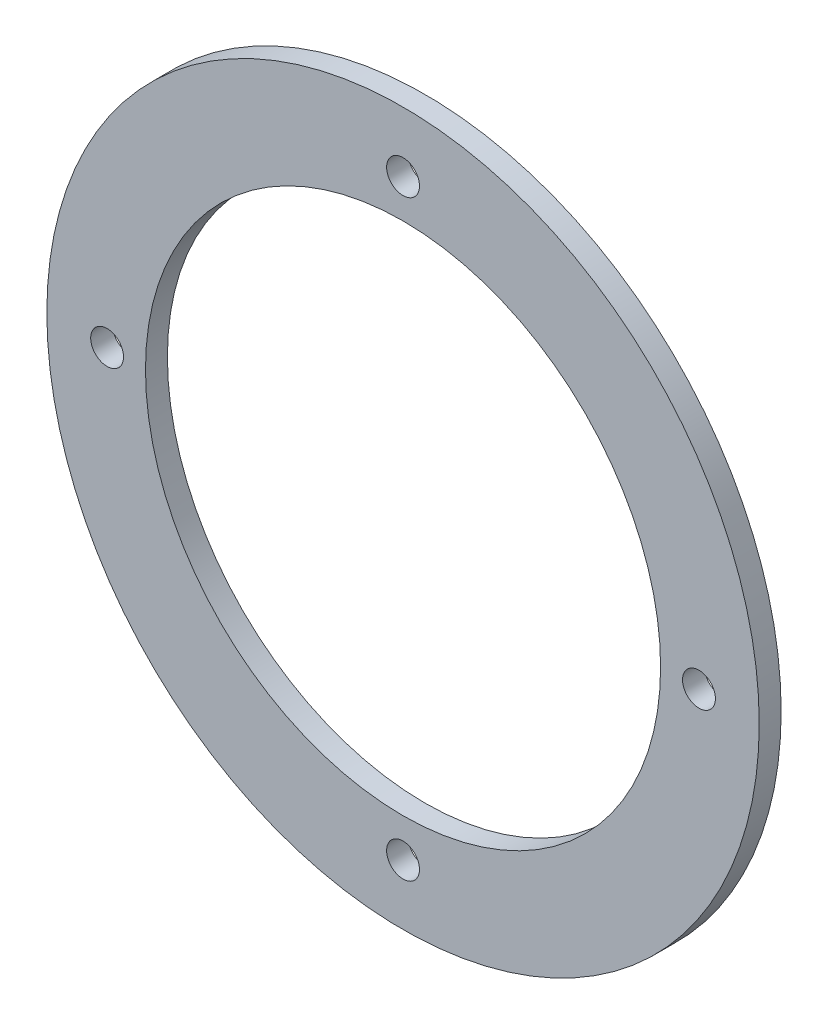
ISO-10303-21;
HEADER;
FILE_DESCRIPTION(('STEP AP214'),'2;1');
FILE_NAME('part.step','',(''),(''),'','','');
FILE_SCHEMA(('AUTOMOTIVE_DESIGN { 1 0 10303 214 1 1 1 1 }'));
ENDSEC;
DATA;
#1=APPLICATION_CONTEXT('core data for automotive mechanical design processes');
#2=APPLICATION_PROTOCOL_DEFINITION('international standard','automotive_design',2000,#1);
#3=PRODUCT_CONTEXT('',#1,'mechanical');
#4=PRODUCT('Part','Part','',(#3));
#5=PRODUCT_RELATED_PRODUCT_CATEGORY('part','',(#4));
#6=PRODUCT_DEFINITION_FORMATION('','',#4);
#7=PRODUCT_DEFINITION_CONTEXT('part definition',#1,'design');
#8=PRODUCT_DEFINITION('design','',#6,#7);
#9=PRODUCT_DEFINITION_SHAPE('','',#8);
#10=(LENGTH_UNIT() NAMED_UNIT(*) SI_UNIT(.MILLI.,.METRE.));
#11=(NAMED_UNIT(*) PLANE_ANGLE_UNIT() SI_UNIT($,.RADIAN.));
#12=(NAMED_UNIT(*) SI_UNIT($,.STERADIAN.) SOLID_ANGLE_UNIT());
#13=UNCERTAINTY_MEASURE_WITH_UNIT(LENGTH_MEASURE(1.E-05),#10,'distance_accuracy_value','');
#14=(GEOMETRIC_REPRESENTATION_CONTEXT(3) GLOBAL_UNCERTAINTY_ASSIGNED_CONTEXT((#13)) GLOBAL_UNIT_ASSIGNED_CONTEXT((#10,
#11,#12)) REPRESENTATION_CONTEXT('',''));
#15=CARTESIAN_POINT('',(0.,0.,0.));
#16=DIRECTION('',(0.,0.,1.));
#17=DIRECTION('',(1.,0.,0.));
#18=AXIS2_PLACEMENT_3D('',#15,#16,#17);
#19=CARTESIAN_POINT('',(0.,0.,2.));
#20=DIRECTION('',(0.,0.,1.));
#21=DIRECTION('',(1.,0.,0.));
#22=AXIS2_PLACEMENT_3D('',#19,#20,#21);
#23=PLANE('',#22);
#24=CARTESIAN_POINT('',(0.,27.,2.));
#25=DIRECTION('',(0.,0.,1.));
#26=DIRECTION('',(1.,0.,0.));
#27=AXIS2_PLACEMENT_3D('',#24,#25,#26);
#28=CIRCLE('',#27,1.5);
#29=CARTESIAN_POINT('',(1.5,27.,2.));
#30=VERTEX_POINT('',#29);
#31=EDGE_CURVE('E59',#30,#30,#28,.T.);
#32=ORIENTED_EDGE('',*,*,#31,.F.);
#33=EDGE_LOOP('',(#32));
#34=FACE_BOUND('',#33,.T.);
#35=CARTESIAN_POINT('',(-27.,0.,2.));
#36=DIRECTION('',(0.,0.,1.));
#37=DIRECTION('',(1.,0.,0.));
#38=AXIS2_PLACEMENT_3D('',#35,#36,#37);
#39=CIRCLE('',#38,1.5);
#40=CARTESIAN_POINT('',(-25.5,0.,2.));
#41=VERTEX_POINT('',#40);
#42=EDGE_CURVE('E47',#41,#41,#39,.T.);
#43=ORIENTED_EDGE('',*,*,#42,.F.);
#44=EDGE_LOOP('',(#43));
#45=FACE_BOUND('',#44,.T.);
#46=CARTESIAN_POINT('',(0.,0.,2.));
#47=DIRECTION('',(0.,0.,1.));
#48=DIRECTION('',(1.,0.,0.));
#49=AXIS2_PLACEMENT_3D('',#46,#47,#48);
#50=CIRCLE('',#49,32.5);
#51=CARTESIAN_POINT('',(32.5,0.,2.));
#52=VERTEX_POINT('',#51);
#53=EDGE_CURVE('E10',#52,#52,#50,.T.);
#54=ORIENTED_EDGE('',*,*,#53,.T.);
#55=EDGE_LOOP('',(#54));
#56=FACE_BOUND('',#55,.T.);
#57=CARTESIAN_POINT('',(0.,0.,2.));
#58=DIRECTION('',(0.,0.,1.));
#59=DIRECTION('',(1.,0.,0.));
#60=AXIS2_PLACEMENT_3D('',#57,#58,#59);
#61=CIRCLE('',#60,23.5);
#62=CARTESIAN_POINT('',(23.5,0.,2.));
#63=VERTEX_POINT('',#62);
#64=EDGE_CURVE('E42',#63,#63,#61,.T.);
#65=ORIENTED_EDGE('',*,*,#64,.F.);
#66=EDGE_LOOP('',(#65));
#67=FACE_BOUND('',#66,.T.);
#68=CARTESIAN_POINT('',(27.,0.,2.));
#69=DIRECTION('',(0.,0.,1.));
#70=DIRECTION('',(1.,0.,0.));
#71=AXIS2_PLACEMENT_3D('',#68,#69,#70);
#72=CIRCLE('',#71,1.5);
#73=CARTESIAN_POINT('',(28.5,0.,2.));
#74=VERTEX_POINT('',#73);
#75=EDGE_CURVE('E53',#74,#74,#72,.T.);
#76=ORIENTED_EDGE('',*,*,#75,.F.);
#77=EDGE_LOOP('',(#76));
#78=FACE_BOUND('',#77,.T.);
#79=CARTESIAN_POINT('',(0.,-27.,2.));
#80=DIRECTION('',(0.,0.,1.));
#81=DIRECTION('',(1.,0.,0.));
#82=AXIS2_PLACEMENT_3D('',#79,#80,#81);
#83=CIRCLE('',#82,1.5);
#84=CARTESIAN_POINT('',(1.5,-27.,2.));
#85=VERTEX_POINT('',#84);
#86=EDGE_CURVE('E65',#85,#85,#83,.T.);
#87=ORIENTED_EDGE('',*,*,#86,.F.);
#88=EDGE_LOOP('',(#87));
#89=FACE_BOUND('',#88,.T.);
#90=ADVANCED_FACE('F31',(#34,#45,#56,#67,#78,#89),#23,.T.);
#91=CARTESIAN_POINT('',(0.,0.,0.));
#92=DIRECTION('',(0.,0.,1.));
#93=DIRECTION('',(1.,0.,0.));
#94=AXIS2_PLACEMENT_3D('',#91,#92,#93);
#95=PLANE('',#94);
#96=CARTESIAN_POINT('',(0.,0.,0.));
#97=DIRECTION('',(0.,0.,1.));
#98=DIRECTION('',(1.,0.,0.));
#99=AXIS2_PLACEMENT_3D('',#96,#97,#98);
#100=CIRCLE('',#99,32.5);
#101=CARTESIAN_POINT('',(32.5,0.,0.));
#102=VERTEX_POINT('',#101);
#103=EDGE_CURVE('E35',#102,#102,#100,.T.);
#104=ORIENTED_EDGE('',*,*,#103,.F.);
#105=EDGE_LOOP('',(#104));
#106=FACE_BOUND('',#105,.T.);
#107=CARTESIAN_POINT('',(0.,0.,0.));
#108=DIRECTION('',(0.,0.,1.));
#109=DIRECTION('',(1.,0.,0.));
#110=AXIS2_PLACEMENT_3D('',#107,#108,#109);
#111=CIRCLE('',#110,23.5);
#112=CARTESIAN_POINT('',(23.5,0.,0.));
#113=VERTEX_POINT('',#112);
#114=EDGE_CURVE('E44',#113,#113,#111,.T.);
#115=ORIENTED_EDGE('',*,*,#114,.T.);
#116=EDGE_LOOP('',(#115));
#117=FACE_BOUND('',#116,.T.);
#118=CARTESIAN_POINT('',(-27.,0.,0.));
#119=DIRECTION('',(0.,0.,1.));
#120=DIRECTION('',(1.,0.,0.));
#121=AXIS2_PLACEMENT_3D('',#118,#119,#120);
#122=CIRCLE('',#121,1.5);
#123=CARTESIAN_POINT('',(-25.5,0.,0.));
#124=VERTEX_POINT('',#123);
#125=EDGE_CURVE('E50',#124,#124,#122,.T.);
#126=ORIENTED_EDGE('',*,*,#125,.T.);
#127=EDGE_LOOP('',(#126));
#128=FACE_BOUND('',#127,.T.);
#129=CARTESIAN_POINT('',(27.,0.,0.));
#130=DIRECTION('',(0.,0.,1.));
#131=DIRECTION('',(1.,0.,0.));
#132=AXIS2_PLACEMENT_3D('',#129,#130,#131);
#133=CIRCLE('',#132,1.5);
#134=CARTESIAN_POINT('',(28.5,0.,0.));
#135=VERTEX_POINT('',#134);
#136=EDGE_CURVE('E56',#135,#135,#133,.T.);
#137=ORIENTED_EDGE('',*,*,#136,.T.);
#138=EDGE_LOOP('',(#137));
#139=FACE_BOUND('',#138,.T.);
#140=CARTESIAN_POINT('',(0.,27.,0.));
#141=DIRECTION('',(0.,0.,1.));
#142=DIRECTION('',(1.,0.,0.));
#143=AXIS2_PLACEMENT_3D('',#140,#141,#142);
#144=CIRCLE('',#143,1.5);
#145=CARTESIAN_POINT('',(1.5,27.,0.));
#146=VERTEX_POINT('',#145);
#147=EDGE_CURVE('E62',#146,#146,#144,.T.);
#148=ORIENTED_EDGE('',*,*,#147,.T.);
#149=EDGE_LOOP('',(#148));
#150=FACE_BOUND('',#149,.T.);
#151=CARTESIAN_POINT('',(0.,-27.,0.));
#152=DIRECTION('',(0.,0.,1.));
#153=DIRECTION('',(1.,0.,0.));
#154=AXIS2_PLACEMENT_3D('',#151,#152,#153);
#155=CIRCLE('',#154,1.5);
#156=CARTESIAN_POINT('',(1.5,-27.,0.));
#157=VERTEX_POINT('',#156);
#158=EDGE_CURVE('E68',#157,#157,#155,.T.);
#159=ORIENTED_EDGE('',*,*,#158,.T.);
#160=EDGE_LOOP('',(#159));
#161=FACE_BOUND('',#160,.T.);
#162=ADVANCED_FACE('F78',(#106,#117,#128,#139,#150,#161),#95,.F.);
#163=CARTESIAN_POINT('',(0.,0.,2.));
#164=DIRECTION('',(0.,0.,-1.));
#165=DIRECTION('',(-1.,0.,0.));
#166=AXIS2_PLACEMENT_3D('',#163,#164,#165);
#167=CYLINDRICAL_SURFACE('',#166,32.5);
#168=ORIENTED_EDGE('',*,*,#53,.F.);
#169=EDGE_LOOP('',(#168));
#170=FACE_BOUND('',#169,.T.);
#171=ORIENTED_EDGE('',*,*,#103,.T.);
#172=EDGE_LOOP('',(#171));
#173=FACE_BOUND('',#172,.T.);
#174=ADVANCED_FACE('F33',(#170,#173),#167,.T.);
#175=CARTESIAN_POINT('',(0.,0.,2.));
#176=DIRECTION('',(0.,0.,-1.));
#177=DIRECTION('',(-1.,0.,0.));
#178=AXIS2_PLACEMENT_3D('',#175,#176,#177);
#179=CYLINDRICAL_SURFACE('',#178,23.5);
#180=ORIENTED_EDGE('',*,*,#64,.T.);
#181=EDGE_LOOP('',(#180));
#182=FACE_BOUND('',#181,.T.);
#183=ORIENTED_EDGE('',*,*,#114,.F.);
#184=EDGE_LOOP('',(#183));
#185=FACE_BOUND('',#184,.T.);
#186=ADVANCED_FACE('F88',(#182,#185),#179,.F.);
#187=CARTESIAN_POINT('',(-27.,0.,2.));
#188=DIRECTION('',(0.,0.,-1.));
#189=DIRECTION('',(-1.,0.,0.));
#190=AXIS2_PLACEMENT_3D('',#187,#188,#189);
#191=CYLINDRICAL_SURFACE('',#190,1.5);
#192=ORIENTED_EDGE('',*,*,#42,.T.);
#193=EDGE_LOOP('',(#192));
#194=FACE_BOUND('',#193,.T.);
#195=ORIENTED_EDGE('',*,*,#125,.F.);
#196=EDGE_LOOP('',(#195));
#197=FACE_BOUND('',#196,.T.);
#198=ADVANCED_FACE('F91',(#194,#197),#191,.F.);
#199=CARTESIAN_POINT('',(27.,0.,2.));
#200=DIRECTION('',(0.,0.,-1.));
#201=DIRECTION('',(-1.,0.,0.));
#202=AXIS2_PLACEMENT_3D('',#199,#200,#201);
#203=CYLINDRICAL_SURFACE('',#202,1.5);
#204=ORIENTED_EDGE('',*,*,#75,.T.);
#205=EDGE_LOOP('',(#204));
#206=FACE_BOUND('',#205,.T.);
#207=ORIENTED_EDGE('',*,*,#136,.F.);
#208=EDGE_LOOP('',(#207));
#209=FACE_BOUND('',#208,.T.);
#210=ADVANCED_FACE('F95',(#206,#209),#203,.F.);
#211=CARTESIAN_POINT('',(0.,27.,2.));
#212=DIRECTION('',(0.,0.,-1.));
#213=DIRECTION('',(-1.,0.,0.));
#214=AXIS2_PLACEMENT_3D('',#211,#212,#213);
#215=CYLINDRICAL_SURFACE('',#214,1.5);
#216=ORIENTED_EDGE('',*,*,#31,.T.);
#217=EDGE_LOOP('',(#216));
#218=FACE_BOUND('',#217,.T.);
#219=ORIENTED_EDGE('',*,*,#147,.F.);
#220=EDGE_LOOP('',(#219));
#221=FACE_BOUND('',#220,.T.);
#222=ADVANCED_FACE('F99',(#218,#221),#215,.F.);
#223=CARTESIAN_POINT('',(0.,-27.,2.));
#224=DIRECTION('',(0.,0.,-1.));
#225=DIRECTION('',(-1.,0.,0.));
#226=AXIS2_PLACEMENT_3D('',#223,#224,#225);
#227=CYLINDRICAL_SURFACE('',#226,1.5);
#228=ORIENTED_EDGE('',*,*,#86,.T.);
#229=EDGE_LOOP('',(#228));
#230=FACE_BOUND('',#229,.T.);
#231=ORIENTED_EDGE('',*,*,#158,.F.);
#232=EDGE_LOOP('',(#231));
#233=FACE_BOUND('',#232,.T.);
#234=ADVANCED_FACE('F74',(#230,#233),#227,.F.);
#235=CLOSED_SHELL('',(#90,#162,#174,#186,#198,#210,#222,#234));
#236=MANIFOLD_SOLID_BREP('B2',#235);
#237=ADVANCED_BREP_SHAPE_REPRESENTATION('',(#18,#236),#14);
#238=SHAPE_DEFINITION_REPRESENTATION(#9,#237);
ENDSEC;
END-ISO-10303-21;
